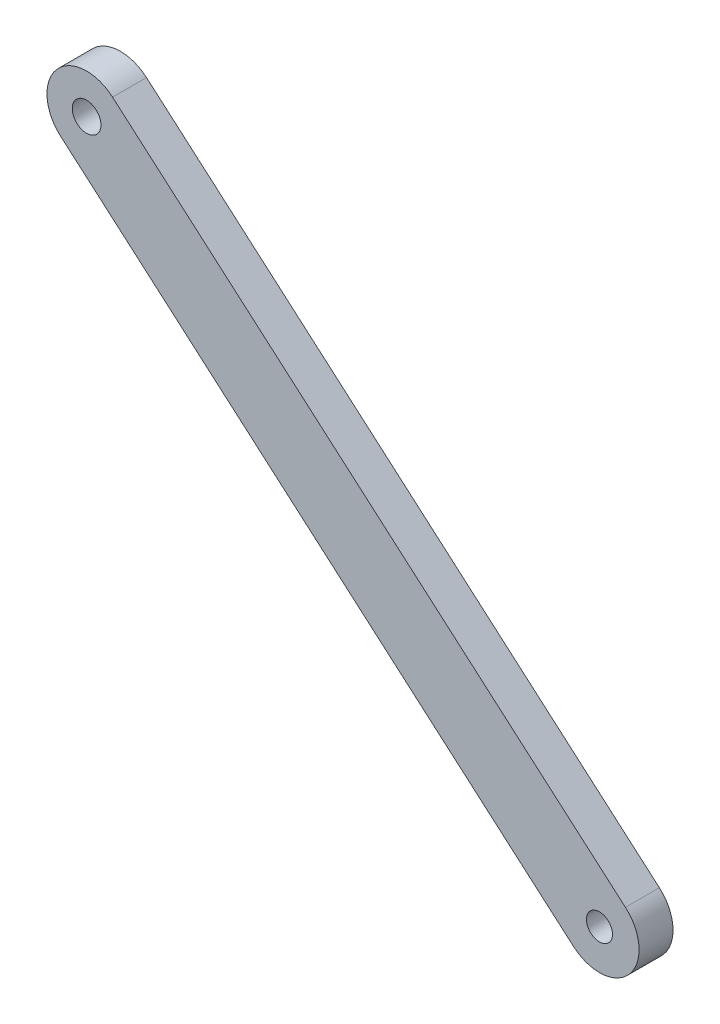
ISO-10303-21;
HEADER;
FILE_DESCRIPTION(('STEP AP214'),'2;1');
FILE_NAME('part.step','',(''),(''),'','','');
FILE_SCHEMA(('AUTOMOTIVE_DESIGN { 1 0 10303 214 1 1 1 1 }'));
ENDSEC;
DATA;
#1=APPLICATION_CONTEXT('core data for automotive mechanical design processes');
#2=APPLICATION_PROTOCOL_DEFINITION('international standard','automotive_design',2000,#1);
#3=PRODUCT_CONTEXT('',#1,'mechanical');
#4=PRODUCT('Part','Part','',(#3));
#5=PRODUCT_RELATED_PRODUCT_CATEGORY('part','',(#4));
#6=PRODUCT_DEFINITION_FORMATION('','',#4);
#7=PRODUCT_DEFINITION_CONTEXT('part definition',#1,'design');
#8=PRODUCT_DEFINITION('design','',#6,#7);
#9=PRODUCT_DEFINITION_SHAPE('','',#8);
#10=(LENGTH_UNIT() NAMED_UNIT(*) SI_UNIT(.MILLI.,.METRE.));
#11=(NAMED_UNIT(*) PLANE_ANGLE_UNIT() SI_UNIT($,.RADIAN.));
#12=(NAMED_UNIT(*) SI_UNIT($,.STERADIAN.) SOLID_ANGLE_UNIT());
#13=UNCERTAINTY_MEASURE_WITH_UNIT(LENGTH_MEASURE(1.E-05),#10,'distance_accuracy_value','');
#14=(GEOMETRIC_REPRESENTATION_CONTEXT(3) GLOBAL_UNCERTAINTY_ASSIGNED_CONTEXT((#13)) GLOBAL_UNIT_ASSIGNED_CONTEXT((#10,
#11,#12)) REPRESENTATION_CONTEXT('',''));
#15=CARTESIAN_POINT('',(0.,0.,0.));
#16=DIRECTION('',(0.,0.,1.));
#17=DIRECTION('',(1.,0.,0.));
#18=AXIS2_PLACEMENT_3D('',#15,#16,#17);
#19=CARTESIAN_POINT('',(19.3041388006566,-22.1274353743027,3.));
#20=DIRECTION('',(0.,0.,1.));
#21=DIRECTION('',(1.,0.,0.));
#22=AXIS2_PLACEMENT_3D('',#19,#20,#21);
#23=PLANE('',#22);
#24=CARTESIAN_POINT('',(19.3041388006566,-22.1274353743027,3.));
#25=DIRECTION('',(0.,0.,1.));
#26=DIRECTION('',(1.,0.,0.));
#27=AXIS2_PLACEMENT_3D('',#24,#25,#26);
#28=CIRCLE('',#27,1.14998787400008);
#29=CARTESIAN_POINT('',(20.4541266746567,-22.1274353743027,3.));
#30=VERTEX_POINT('',#29);
#31=EDGE_CURVE('E114',#30,#30,#28,.T.);
#32=ORIENTED_EDGE('',*,*,#31,.F.);
#33=EDGE_LOOP('',(#32));
#34=FACE_BOUND('',#33,.T.);
#35=CARTESIAN_POINT('',(19.3041388006566,-22.1274353743027,3.));
#36=DIRECTION('',(0.,0.,1.));
#37=DIRECTION('',(1.,0.,0.));
#38=AXIS2_PLACEMENT_3D('',#35,#36,#37);
#39=CIRCLE('',#38,3.5);
#40=CARTESIAN_POINT('',(17.009802298855,-24.7705433964048,3.));
#41=VERTEX_POINT('',#40);
#42=CARTESIAN_POINT('',(21.5984753024582,-19.4843273522005,3.));
#43=VERTEX_POINT('',#42);
#44=EDGE_CURVE('E94',#41,#43,#39,.T.);
#45=ORIENTED_EDGE('',*,*,#44,.T.);
#46=DIRECTION('',(-0.755173720600613,0.655524714800462,0.));
#47=VECTOR('',#46,1.);
#48=CARTESIAN_POINT('',(21.5984753024582,-19.4843273522005,3.));
#49=LINE('',#48,#47);
#50=CARTESIAN_POINT('',(-23.7119479335786,19.8471555358272,3.));
#51=VERTEX_POINT('',#50);
#52=EDGE_CURVE('E89',#43,#51,#49,.T.);
#53=ORIENTED_EDGE('',*,*,#52,.T.);
#54=CARTESIAN_POINT('',(-26.0062844353802,17.204047513725,3.));
#55=DIRECTION('',(0.,0.,1.));
#56=DIRECTION('',(1.,0.,0.));
#57=AXIS2_PLACEMENT_3D('',#54,#55,#56);
#58=CIRCLE('',#57,3.5);
#59=CARTESIAN_POINT('',(-28.3006209371818,14.5609394916229,3.));
#60=VERTEX_POINT('',#59);
#61=EDGE_CURVE('E92',#51,#60,#58,.T.);
#62=ORIENTED_EDGE('',*,*,#61,.T.);
#63=DIRECTION('',(0.755173720600613,-0.655524714800462,0.));
#64=VECTOR('',#63,1.);
#65=CARTESIAN_POINT('',(17.009802298855,-24.7705433964048,3.));
#66=LINE('',#65,#64);
#67=EDGE_CURVE('E59',#60,#41,#66,.T.);
#68=ORIENTED_EDGE('',*,*,#67,.T.);
#69=EDGE_LOOP('',(#45,#53,#62,#68));
#70=FACE_BOUND('',#69,.T.);
#71=CARTESIAN_POINT('',(-26.0062844353802,17.204047513725,3.));
#72=DIRECTION('',(0.,0.,1.));
#73=DIRECTION('',(1.,0.,0.));
#74=AXIS2_PLACEMENT_3D('',#71,#72,#73);
#75=CIRCLE('',#74,1.26810309373154);
#76=CARTESIAN_POINT('',(-24.7381813416486,17.204047513725,3.));
#77=VERTEX_POINT('',#76);
#78=EDGE_CURVE('E136',#77,#77,#75,.T.);
#79=ORIENTED_EDGE('',*,*,#78,.F.);
#80=EDGE_LOOP('',(#79));
#81=FACE_BOUND('',#80,.T.);
#82=ADVANCED_FACE('F41',(#34,#70,#81),#23,.T.);
#83=CARTESIAN_POINT('',(19.3041388006566,-22.1274353743027,0.));
#84=DIRECTION('',(0.,0.,1.));
#85=DIRECTION('',(1.,0.,0.));
#86=AXIS2_PLACEMENT_3D('',#83,#84,#85);
#87=PLANE('',#86);
#88=CARTESIAN_POINT('',(19.3041388006566,-22.1274353743027,0.));
#89=DIRECTION('',(0.,0.,1.));
#90=DIRECTION('',(1.,0.,0.));
#91=AXIS2_PLACEMENT_3D('',#88,#89,#90);
#92=CIRCLE('',#91,3.5);
#93=CARTESIAN_POINT('',(17.009802298855,-24.7705433964048,0.));
#94=VERTEX_POINT('',#93);
#95=CARTESIAN_POINT('',(21.5984753024582,-19.4843273522005,0.));
#96=VERTEX_POINT('',#95);
#97=EDGE_CURVE('E110',#94,#96,#92,.T.);
#98=ORIENTED_EDGE('',*,*,#97,.F.);
#99=DIRECTION('',(0.755173720600613,-0.655524714800462,0.));
#100=VECTOR('',#99,1.);
#101=CARTESIAN_POINT('',(17.009802298855,-24.7705433964048,0.));
#102=LINE('',#101,#100);
#103=CARTESIAN_POINT('',(-28.3006209371818,14.5609394916229,0.));
#104=VERTEX_POINT('',#103);
#105=EDGE_CURVE('E82',#104,#94,#102,.T.);
#106=ORIENTED_EDGE('',*,*,#105,.F.);
#107=CARTESIAN_POINT('',(-26.0062844353802,17.204047513725,0.));
#108=DIRECTION('',(0.,0.,1.));
#109=DIRECTION('',(1.,0.,0.));
#110=AXIS2_PLACEMENT_3D('',#107,#108,#109);
#111=CIRCLE('',#110,3.5);
#112=CARTESIAN_POINT('',(-23.7119479335786,19.8471555358272,0.));
#113=VERTEX_POINT('',#112);
#114=EDGE_CURVE('E76',#113,#104,#111,.T.);
#115=ORIENTED_EDGE('',*,*,#114,.F.);
#116=DIRECTION('',(-0.755173720600613,0.655524714800462,0.));
#117=VECTOR('',#116,1.);
#118=CARTESIAN_POINT('',(21.5984753024582,-19.4843273522005,0.));
#119=LINE('',#118,#117);
#120=EDGE_CURVE('E99',#96,#113,#119,.T.);
#121=ORIENTED_EDGE('',*,*,#120,.F.);
#122=EDGE_LOOP('',(#98,#106,#115,#121));
#123=FACE_BOUND('',#122,.T.);
#124=CARTESIAN_POINT('',(19.3041388006566,-22.1274353743027,0.));
#125=DIRECTION('',(0.,0.,1.));
#126=DIRECTION('',(1.,0.,0.));
#127=AXIS2_PLACEMENT_3D('',#124,#125,#126);
#128=CIRCLE('',#127,1.14998787400008);
#129=CARTESIAN_POINT('',(20.4541266746567,-22.1274353743027,0.));
#130=VERTEX_POINT('',#129);
#131=EDGE_CURVE('E132',#130,#130,#128,.T.);
#132=ORIENTED_EDGE('',*,*,#131,.T.);
#133=EDGE_LOOP('',(#132));
#134=FACE_BOUND('',#133,.T.);
#135=CARTESIAN_POINT('',(-26.0062844353802,17.204047513725,0.));
#136=DIRECTION('',(0.,0.,1.));
#137=DIRECTION('',(1.,0.,0.));
#138=AXIS2_PLACEMENT_3D('',#135,#136,#137);
#139=CIRCLE('',#138,1.26810309373154);
#140=CARTESIAN_POINT('',(-24.7381813416486,17.204047513725,0.));
#141=VERTEX_POINT('',#140);
#142=EDGE_CURVE('E140',#141,#141,#139,.T.);
#143=ORIENTED_EDGE('',*,*,#142,.T.);
#144=EDGE_LOOP('',(#143));
#145=FACE_BOUND('',#144,.T.);
#146=ADVANCED_FACE('F127',(#123,#134,#145),#87,.F.);
#147=CARTESIAN_POINT('',(19.3041388006566,-22.1274353743027,3.));
#148=DIRECTION('',(0.,0.,-1.));
#149=DIRECTION('',(-1.,0.,0.));
#150=AXIS2_PLACEMENT_3D('',#147,#148,#149);
#151=CYLINDRICAL_SURFACE('',#150,3.5);
#152=ORIENTED_EDGE('',*,*,#97,.T.);
#153=DIRECTION('',(0.,0.,-1.));
#154=VECTOR('',#153,1.);
#155=CARTESIAN_POINT('',(21.5984753024582,-19.4843273522005,3.));
#156=LINE('',#155,#154);
#157=EDGE_CURVE('E11',#43,#96,#156,.T.);
#158=ORIENTED_EDGE('',*,*,#157,.F.);
#159=ORIENTED_EDGE('',*,*,#44,.F.);
#160=DIRECTION('',(0.,0.,-1.));
#161=VECTOR('',#160,1.);
#162=CARTESIAN_POINT('',(17.009802298855,-24.7705433964048,3.));
#163=LINE('',#162,#161);
#164=EDGE_CURVE('E106',#41,#94,#163,.T.);
#165=ORIENTED_EDGE('',*,*,#164,.T.);
#166=EDGE_LOOP('',(#152,#158,#159,#165));
#167=FACE_BOUND('',#166,.T.);
#168=ADVANCED_FACE('F43',(#167),#151,.T.);
#169=CARTESIAN_POINT('',(21.5984753024582,-19.4843273522005,3.));
#170=DIRECTION('',(-0.655524714800462,-0.755173720600613,0.));
#171=DIRECTION('',(0.755173720600613,-0.655524714800462,0.));
#172=AXIS2_PLACEMENT_3D('',#169,#170,#171);
#173=PLANE('',#172);
#174=ORIENTED_EDGE('',*,*,#120,.T.);
#175=DIRECTION('',(0.,0.,-1.));
#176=VECTOR('',#175,1.);
#177=CARTESIAN_POINT('',(-23.7119479335786,19.8471555358272,3.));
#178=LINE('',#177,#176);
#179=EDGE_CURVE('E51',#51,#113,#178,.T.);
#180=ORIENTED_EDGE('',*,*,#179,.F.);
#181=ORIENTED_EDGE('',*,*,#52,.F.);
#182=ORIENTED_EDGE('',*,*,#157,.T.);
#183=EDGE_LOOP('',(#174,#180,#181,#182));
#184=FACE_BOUND('',#183,.T.);
#185=ADVANCED_FACE('F98',(#184),#173,.F.);
#186=CARTESIAN_POINT('',(-26.0062844353802,17.204047513725,3.));
#187=DIRECTION('',(0.,0.,-1.));
#188=DIRECTION('',(-1.,0.,0.));
#189=AXIS2_PLACEMENT_3D('',#186,#187,#188);
#190=CYLINDRICAL_SURFACE('',#189,3.5);
#191=ORIENTED_EDGE('',*,*,#114,.T.);
#192=DIRECTION('',(0.,0.,-1.));
#193=VECTOR('',#192,1.);
#194=CARTESIAN_POINT('',(-28.3006209371818,14.5609394916229,3.));
#195=LINE('',#194,#193);
#196=EDGE_CURVE('E101',#60,#104,#195,.T.);
#197=ORIENTED_EDGE('',*,*,#196,.F.);
#198=ORIENTED_EDGE('',*,*,#61,.F.);
#199=ORIENTED_EDGE('',*,*,#179,.T.);
#200=EDGE_LOOP('',(#191,#197,#198,#199));
#201=FACE_BOUND('',#200,.T.);
#202=ADVANCED_FACE('F102',(#201),#190,.T.);
#203=CARTESIAN_POINT('',(17.009802298855,-24.7705433964048,3.));
#204=DIRECTION('',(0.655524714800462,0.755173720600613,0.));
#205=DIRECTION('',(-0.755173720600613,0.655524714800462,0.));
#206=AXIS2_PLACEMENT_3D('',#203,#204,#205);
#207=PLANE('',#206);
#208=ORIENTED_EDGE('',*,*,#105,.T.);
#209=ORIENTED_EDGE('',*,*,#164,.F.);
#210=ORIENTED_EDGE('',*,*,#67,.F.);
#211=ORIENTED_EDGE('',*,*,#196,.T.);
#212=EDGE_LOOP('',(#208,#209,#210,#211));
#213=FACE_BOUND('',#212,.T.);
#214=ADVANCED_FACE('F124',(#213),#207,.F.);
#215=CARTESIAN_POINT('',(19.3041388006566,-22.1274353743027,3.));
#216=DIRECTION('',(0.,0.,-1.));
#217=DIRECTION('',(-1.,0.,0.));
#218=AXIS2_PLACEMENT_3D('',#215,#216,#217);
#219=CYLINDRICAL_SURFACE('',#218,1.14998787400008);
#220=ORIENTED_EDGE('',*,*,#31,.T.);
#221=EDGE_LOOP('',(#220));
#222=FACE_BOUND('',#221,.T.);
#223=ORIENTED_EDGE('',*,*,#131,.F.);
#224=EDGE_LOOP('',(#223));
#225=FACE_BOUND('',#224,.T.);
#226=ADVANCED_FACE('F159',(#222,#225),#219,.F.);
#227=CARTESIAN_POINT('',(-26.0062844353802,17.204047513725,3.));
#228=DIRECTION('',(0.,0.,-1.));
#229=DIRECTION('',(-1.,0.,0.));
#230=AXIS2_PLACEMENT_3D('',#227,#228,#229);
#231=CYLINDRICAL_SURFACE('',#230,1.26810309373154);
#232=ORIENTED_EDGE('',*,*,#78,.T.);
#233=EDGE_LOOP('',(#232));
#234=FACE_BOUND('',#233,.T.);
#235=ORIENTED_EDGE('',*,*,#142,.F.);
#236=EDGE_LOOP('',(#235));
#237=FACE_BOUND('',#236,.T.);
#238=ADVANCED_FACE('F148',(#234,#237),#231,.F.);
#239=CLOSED_SHELL('',(#82,#146,#168,#185,#202,#214,#226,#238));
#240=MANIFOLD_SOLID_BREP('B2',#239);
#241=ADVANCED_BREP_SHAPE_REPRESENTATION('',(#18,#240),#14);
#242=SHAPE_DEFINITION_REPRESENTATION(#9,#241);
ENDSEC;
END-ISO-10303-21;
